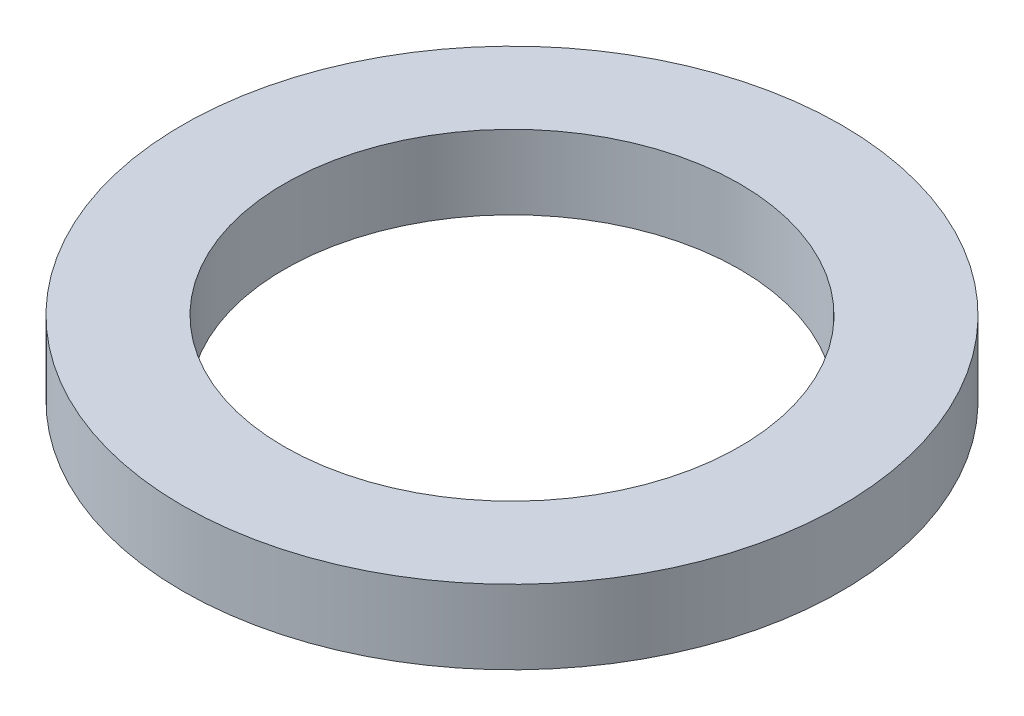
ISO-10303-21;
HEADER;
FILE_DESCRIPTION(('STEP AP214'),'2;1');
FILE_NAME('part.step','',(''),(''),'','','');
FILE_SCHEMA(('AUTOMOTIVE_DESIGN { 1 0 10303 214 1 1 1 1 }'));
ENDSEC;
DATA;
#1=APPLICATION_CONTEXT('core data for automotive mechanical design processes');
#2=APPLICATION_PROTOCOL_DEFINITION('international standard','automotive_design',2000,#1);
#3=PRODUCT_CONTEXT('',#1,'mechanical');
#4=PRODUCT('Part','Part','',(#3));
#5=PRODUCT_RELATED_PRODUCT_CATEGORY('part','',(#4));
#6=PRODUCT_DEFINITION_FORMATION('','',#4);
#7=PRODUCT_DEFINITION_CONTEXT('part definition',#1,'design');
#8=PRODUCT_DEFINITION('design','',#6,#7);
#9=PRODUCT_DEFINITION_SHAPE('','',#8);
#10=(LENGTH_UNIT() NAMED_UNIT(*) SI_UNIT(.MILLI.,.METRE.));
#11=(NAMED_UNIT(*) PLANE_ANGLE_UNIT() SI_UNIT($,.RADIAN.));
#12=(NAMED_UNIT(*) SI_UNIT($,.STERADIAN.) SOLID_ANGLE_UNIT());
#13=UNCERTAINTY_MEASURE_WITH_UNIT(LENGTH_MEASURE(1.E-05),#10,'distance_accuracy_value','');
#14=(GEOMETRIC_REPRESENTATION_CONTEXT(3) GLOBAL_UNCERTAINTY_ASSIGNED_CONTEXT((#13)) GLOBAL_UNIT_ASSIGNED_CONTEXT((#10,
#11,#12)) REPRESENTATION_CONTEXT('',''));
#15=CARTESIAN_POINT('',(0.,0.,0.));
#16=DIRECTION('',(0.,0.,1.));
#17=DIRECTION('',(1.,0.,0.));
#18=AXIS2_PLACEMENT_3D('',#15,#16,#17);
#19=CARTESIAN_POINT('',(0.,0.508,0.));
#20=DIRECTION('',(0.,-1.,0.));
#21=DIRECTION('',(0.,0.,-1.));
#22=AXIS2_PLACEMENT_3D('',#19,#20,#21);
#23=CYLINDRICAL_SURFACE('',#22,2.2606);
#24=CARTESIAN_POINT('',(0.,0.508,0.));
#25=DIRECTION('',(0.,1.,0.));
#26=DIRECTION('',(0.,0.,1.));
#27=AXIS2_PLACEMENT_3D('',#24,#25,#26);
#28=CIRCLE('',#27,2.2606);
#29=CARTESIAN_POINT('',(0.,0.508,2.2606));
#30=VERTEX_POINT('',#29);
#31=EDGE_CURVE('E10',#30,#30,#28,.T.);
#32=ORIENTED_EDGE('',*,*,#31,.F.);
#33=EDGE_LOOP('',(#32));
#34=FACE_BOUND('',#33,.T.);
#35=CARTESIAN_POINT('',(0.,0.,0.));
#36=DIRECTION('',(0.,1.,0.));
#37=DIRECTION('',(0.,0.,1.));
#38=AXIS2_PLACEMENT_3D('',#35,#36,#37);
#39=CIRCLE('',#38,2.2606);
#40=CARTESIAN_POINT('',(0.,0.,2.2606));
#41=VERTEX_POINT('',#40);
#42=EDGE_CURVE('E38',#41,#41,#39,.T.);
#43=ORIENTED_EDGE('',*,*,#42,.T.);
#44=EDGE_LOOP('',(#43));
#45=FACE_BOUND('',#44,.T.);
#46=ADVANCED_FACE('F35',(#34,#45),#23,.T.);
#47=CARTESIAN_POINT('',(0.,0.508,0.));
#48=DIRECTION('',(0.,1.,0.));
#49=DIRECTION('',(0.,0.,1.));
#50=AXIS2_PLACEMENT_3D('',#47,#48,#49);
#51=PLANE('',#50);
#52=CARTESIAN_POINT('',(0.,0.508,0.));
#53=DIRECTION('',(0.,1.,0.));
#54=DIRECTION('',(0.,0.,1.));
#55=AXIS2_PLACEMENT_3D('',#52,#53,#54);
#56=CIRCLE('',#55,1.5621);
#57=CARTESIAN_POINT('',(0.,0.508,1.5621));
#58=VERTEX_POINT('',#57);
#59=EDGE_CURVE('E47',#58,#58,#56,.T.);
#60=ORIENTED_EDGE('',*,*,#59,.F.);
#61=EDGE_LOOP('',(#60));
#62=FACE_BOUND('',#61,.T.);
#63=ORIENTED_EDGE('',*,*,#31,.T.);
#64=EDGE_LOOP('',(#63));
#65=FACE_BOUND('',#64,.T.);
#66=ADVANCED_FACE('F62',(#62,#65),#51,.T.);
#67=CARTESIAN_POINT('',(0.,0.,0.));
#68=DIRECTION('',(0.,1.,0.));
#69=DIRECTION('',(0.,0.,1.));
#70=AXIS2_PLACEMENT_3D('',#67,#68,#69);
#71=PLANE('',#70);
#72=CARTESIAN_POINT('',(0.,0.,0.));
#73=DIRECTION('',(0.,1.,0.));
#74=DIRECTION('',(0.,0.,1.));
#75=AXIS2_PLACEMENT_3D('',#72,#73,#74);
#76=CIRCLE('',#75,1.5621);
#77=CARTESIAN_POINT('',(0.,0.,1.5621));
#78=VERTEX_POINT('',#77);
#79=EDGE_CURVE('E45',#78,#78,#76,.T.);
#80=ORIENTED_EDGE('',*,*,#79,.T.);
#81=EDGE_LOOP('',(#80));
#82=FACE_BOUND('',#81,.T.);
#83=ORIENTED_EDGE('',*,*,#42,.F.);
#84=EDGE_LOOP('',(#83));
#85=FACE_BOUND('',#84,.T.);
#86=ADVANCED_FACE('F53',(#82,#85),#71,.F.);
#87=CARTESIAN_POINT('',(0.,0.,0.));
#88=DIRECTION('',(0.,1.,0.));
#89=DIRECTION('',(0.,0.,1.));
#90=AXIS2_PLACEMENT_3D('',#87,#88,#89);
#91=CYLINDRICAL_SURFACE('',#90,1.5621);
#92=ORIENTED_EDGE('',*,*,#79,.F.);
#93=EDGE_LOOP('',(#92));
#94=FACE_BOUND('',#93,.T.);
#95=ORIENTED_EDGE('',*,*,#59,.T.);
#96=EDGE_LOOP('',(#95));
#97=FACE_BOUND('',#96,.T.);
#98=ADVANCED_FACE('F56',(#94,#97),#91,.F.);
#99=CLOSED_SHELL('',(#46,#66,#86,#98));
#100=MANIFOLD_SOLID_BREP('B2',#99);
#101=ADVANCED_BREP_SHAPE_REPRESENTATION('',(#18,#100),#14);
#102=SHAPE_DEFINITION_REPRESENTATION(#9,#101);
ENDSEC;
END-ISO-10303-21;
